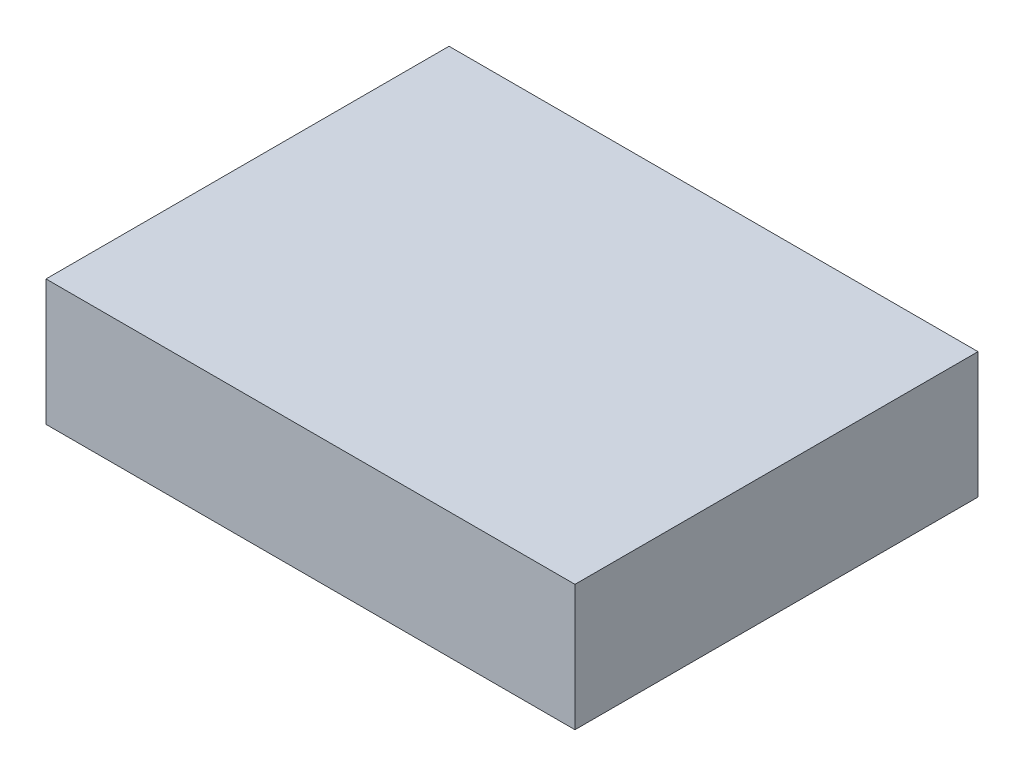
ISO-10303-21;
HEADER;
FILE_DESCRIPTION(('STEP AP214'),'2;1');
FILE_NAME('part.step','',(''),(''),'','','');
FILE_SCHEMA(('AUTOMOTIVE_DESIGN { 1 0 10303 214 1 1 1 1 }'));
ENDSEC;
DATA;
#1=APPLICATION_CONTEXT('core data for automotive mechanical design processes');
#2=APPLICATION_PROTOCOL_DEFINITION('international standard','automotive_design',2000,#1);
#3=PRODUCT_CONTEXT('',#1,'mechanical');
#4=PRODUCT('Part','Part','',(#3));
#5=PRODUCT_RELATED_PRODUCT_CATEGORY('part','',(#4));
#6=PRODUCT_DEFINITION_FORMATION('','',#4);
#7=PRODUCT_DEFINITION_CONTEXT('part definition',#1,'design');
#8=PRODUCT_DEFINITION('design','',#6,#7);
#9=PRODUCT_DEFINITION_SHAPE('','',#8);
#10=(LENGTH_UNIT() NAMED_UNIT(*) SI_UNIT(.MILLI.,.METRE.));
#11=(NAMED_UNIT(*) PLANE_ANGLE_UNIT() SI_UNIT($,.RADIAN.));
#12=(NAMED_UNIT(*) SI_UNIT($,.STERADIAN.) SOLID_ANGLE_UNIT());
#13=UNCERTAINTY_MEASURE_WITH_UNIT(LENGTH_MEASURE(1.E-05),#10,'distance_accuracy_value','');
#14=(GEOMETRIC_REPRESENTATION_CONTEXT(3) GLOBAL_UNCERTAINTY_ASSIGNED_CONTEXT((#13)) GLOBAL_UNIT_ASSIGNED_CONTEXT((#10,
#11,#12)) REPRESENTATION_CONTEXT('',''));
#15=CARTESIAN_POINT('',(0.,0.,0.));
#16=DIRECTION('',(0.,0.,1.));
#17=DIRECTION('',(1.,0.,0.));
#18=AXIS2_PLACEMENT_3D('',#15,#16,#17);
#19=CARTESIAN_POINT('',(10.5,5.,8.));
#20=DIRECTION('',(-1.,0.,0.));
#21=DIRECTION('',(0.,0.,1.));
#22=AXIS2_PLACEMENT_3D('',#19,#20,#21);
#23=PLANE('',#22);
#24=DIRECTION('',(0.,0.,-1.));
#25=VECTOR('',#24,1.);
#26=CARTESIAN_POINT('',(10.5,0.,8.));
#27=LINE('',#26,#25);
#28=CARTESIAN_POINT('',(10.5,0.,8.));
#29=VERTEX_POINT('',#28);
#30=CARTESIAN_POINT('',(10.5,0.,-8.));
#31=VERTEX_POINT('',#30);
#32=EDGE_CURVE('E119',#29,#31,#27,.T.);
#33=ORIENTED_EDGE('',*,*,#32,.T.);
#34=DIRECTION('',(0.,-1.,0.));
#35=VECTOR('',#34,1.);
#36=CARTESIAN_POINT('',(10.5,5.,-8.));
#37=LINE('',#36,#35);
#38=CARTESIAN_POINT('',(10.5,5.,-8.));
#39=VERTEX_POINT('',#38);
#40=EDGE_CURVE('E11',#39,#31,#37,.T.);
#41=ORIENTED_EDGE('',*,*,#40,.F.);
#42=DIRECTION('',(0.,0.,-1.));
#43=VECTOR('',#42,1.);
#44=CARTESIAN_POINT('',(10.5,5.,8.));
#45=LINE('',#44,#43);
#46=CARTESIAN_POINT('',(10.5,5.,8.));
#47=VERTEX_POINT('',#46);
#48=EDGE_CURVE('E102',#47,#39,#45,.T.);
#49=ORIENTED_EDGE('',*,*,#48,.F.);
#50=DIRECTION('',(0.,-1.,0.));
#51=VECTOR('',#50,1.);
#52=CARTESIAN_POINT('',(10.5,5.,8.));
#53=LINE('',#52,#51);
#54=EDGE_CURVE('E113',#47,#29,#53,.T.);
#55=ORIENTED_EDGE('',*,*,#54,.T.);
#56=EDGE_LOOP('',(#33,#41,#49,#55));
#57=FACE_BOUND('',#56,.T.);
#58=ADVANCED_FACE('F47',(#57),#23,.F.);
#59=CARTESIAN_POINT('',(-10.5,5.,-8.));
#60=DIRECTION('',(0.,0.,1.));
#61=DIRECTION('',(1.,0.,0.));
#62=AXIS2_PLACEMENT_3D('',#59,#60,#61);
#63=PLANE('',#62);
#64=DIRECTION('',(-1.,0.,0.));
#65=VECTOR('',#64,1.);
#66=CARTESIAN_POINT('',(-10.5,0.,-8.));
#67=LINE('',#66,#65);
#68=CARTESIAN_POINT('',(-10.5,0.,-8.));
#69=VERTEX_POINT('',#68);
#70=EDGE_CURVE('E107',#31,#69,#67,.T.);
#71=ORIENTED_EDGE('',*,*,#70,.T.);
#72=DIRECTION('',(0.,-1.,0.));
#73=VECTOR('',#72,1.);
#74=CARTESIAN_POINT('',(-10.5,5.,-8.));
#75=LINE('',#74,#73);
#76=CARTESIAN_POINT('',(-10.5,5.,-8.));
#77=VERTEX_POINT('',#76);
#78=EDGE_CURVE('E59',#77,#69,#75,.T.);
#79=ORIENTED_EDGE('',*,*,#78,.F.);
#80=DIRECTION('',(-1.,0.,0.));
#81=VECTOR('',#80,1.);
#82=CARTESIAN_POINT('',(-10.5,5.,-8.));
#83=LINE('',#82,#81);
#84=EDGE_CURVE('E96',#39,#77,#83,.T.);
#85=ORIENTED_EDGE('',*,*,#84,.F.);
#86=ORIENTED_EDGE('',*,*,#40,.T.);
#87=EDGE_LOOP('',(#71,#79,#85,#86));
#88=FACE_BOUND('',#87,.T.);
#89=ADVANCED_FACE('F103',(#88),#63,.F.);
#90=CARTESIAN_POINT('',(-10.5,5.,8.));
#91=DIRECTION('',(1.,0.,0.));
#92=DIRECTION('',(0.,0.,-1.));
#93=AXIS2_PLACEMENT_3D('',#90,#91,#92);
#94=PLANE('',#93);
#95=DIRECTION('',(0.,0.,1.));
#96=VECTOR('',#95,1.);
#97=CARTESIAN_POINT('',(-10.5,0.,8.));
#98=LINE('',#97,#96);
#99=CARTESIAN_POINT('',(-10.5,0.,8.));
#100=VERTEX_POINT('',#99);
#101=EDGE_CURVE('E81',#69,#100,#98,.T.);
#102=ORIENTED_EDGE('',*,*,#101,.T.);
#103=DIRECTION('',(0.,-1.,0.));
#104=VECTOR('',#103,1.);
#105=CARTESIAN_POINT('',(-10.5,5.,8.));
#106=LINE('',#105,#104);
#107=CARTESIAN_POINT('',(-10.5,5.,8.));
#108=VERTEX_POINT('',#107);
#109=EDGE_CURVE('E108',#108,#100,#106,.T.);
#110=ORIENTED_EDGE('',*,*,#109,.F.);
#111=DIRECTION('',(0.,0.,1.));
#112=VECTOR('',#111,1.);
#113=CARTESIAN_POINT('',(-10.5,5.,8.));
#114=LINE('',#113,#112);
#115=EDGE_CURVE('E98',#77,#108,#114,.T.);
#116=ORIENTED_EDGE('',*,*,#115,.F.);
#117=ORIENTED_EDGE('',*,*,#78,.T.);
#118=EDGE_LOOP('',(#102,#110,#116,#117));
#119=FACE_BOUND('',#118,.T.);
#120=ADVANCED_FACE('F109',(#119),#94,.F.);
#121=CARTESIAN_POINT('',(-10.5,5.,8.));
#122=DIRECTION('',(0.,0.,-1.));
#123=DIRECTION('',(-1.,0.,0.));
#124=AXIS2_PLACEMENT_3D('',#121,#122,#123);
#125=PLANE('',#124);
#126=DIRECTION('',(1.,0.,0.));
#127=VECTOR('',#126,1.);
#128=CARTESIAN_POINT('',(-10.5,0.,8.));
#129=LINE('',#128,#127);
#130=EDGE_CURVE('E87',#100,#29,#129,.T.);
#131=ORIENTED_EDGE('',*,*,#130,.T.);
#132=ORIENTED_EDGE('',*,*,#54,.F.);
#133=DIRECTION('',(1.,0.,0.));
#134=VECTOR('',#133,1.);
#135=CARTESIAN_POINT('',(-10.5,5.,8.));
#136=LINE('',#135,#134);
#137=EDGE_CURVE('E67',#108,#47,#136,.T.);
#138=ORIENTED_EDGE('',*,*,#137,.F.);
#139=ORIENTED_EDGE('',*,*,#109,.T.);
#140=EDGE_LOOP('',(#131,#132,#138,#139));
#141=FACE_BOUND('',#140,.T.);
#142=ADVANCED_FACE('F135',(#141),#125,.F.);
#143=CARTESIAN_POINT('',(0.,5.,0.));
#144=DIRECTION('',(0.,-1.,0.));
#145=DIRECTION('',(0.,0.,-1.));
#146=AXIS2_PLACEMENT_3D('',#143,#144,#145);
#147=PLANE('',#146);
#148=ORIENTED_EDGE('',*,*,#48,.T.);
#149=ORIENTED_EDGE('',*,*,#84,.T.);
#150=ORIENTED_EDGE('',*,*,#115,.T.);
#151=ORIENTED_EDGE('',*,*,#137,.T.);
#152=EDGE_LOOP('',(#148,#149,#150,#151));
#153=FACE_BOUND('',#152,.T.);
#154=ADVANCED_FACE('F100',(#153),#147,.F.);
#155=CARTESIAN_POINT('',(0.,0.,0.));
#156=DIRECTION('',(0.,-1.,0.));
#157=DIRECTION('',(0.,0.,-1.));
#158=AXIS2_PLACEMENT_3D('',#155,#156,#157);
#159=PLANE('',#158);
#160=ORIENTED_EDGE('',*,*,#32,.F.);
#161=ORIENTED_EDGE('',*,*,#130,.F.);
#162=ORIENTED_EDGE('',*,*,#101,.F.);
#163=ORIENTED_EDGE('',*,*,#70,.F.);
#164=EDGE_LOOP('',(#160,#161,#162,#163));
#165=FACE_BOUND('',#164,.T.);
#166=ADVANCED_FACE('F134',(#165),#159,.T.);
#167=CLOSED_SHELL('',(#58,#89,#120,#142,#154,#166));
#168=MANIFOLD_SOLID_BREP('B2',#167);
#169=ADVANCED_BREP_SHAPE_REPRESENTATION('',(#18,#168),#14);
#170=SHAPE_DEFINITION_REPRESENTATION(#9,#169);
ENDSEC;
END-ISO-10303-21;
